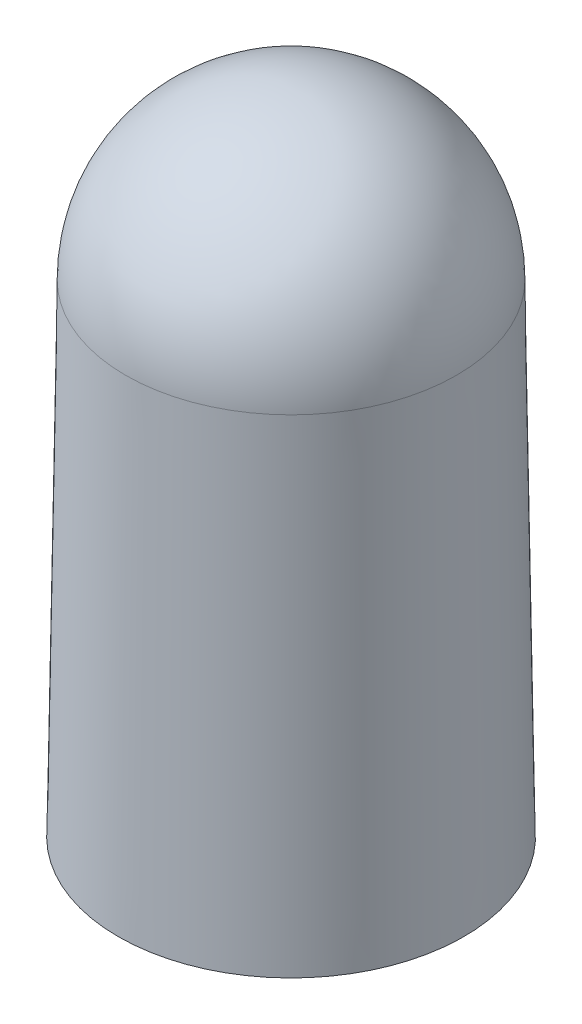
ISO-10303-21;
HEADER;
FILE_DESCRIPTION(('STEP AP214'),'2;1');
FILE_NAME('part.step','',(''),(''),'','','');
FILE_SCHEMA(('AUTOMOTIVE_DESIGN { 1 0 10303 214 1 1 1 1 }'));
ENDSEC;
DATA;
#1=APPLICATION_CONTEXT('core data for automotive mechanical design processes');
#2=APPLICATION_PROTOCOL_DEFINITION('international standard','automotive_design',2000,#1);
#3=PRODUCT_CONTEXT('',#1,'mechanical');
#4=PRODUCT('Part','Part','',(#3));
#5=PRODUCT_RELATED_PRODUCT_CATEGORY('part','',(#4));
#6=PRODUCT_DEFINITION_FORMATION('','',#4);
#7=PRODUCT_DEFINITION_CONTEXT('part definition',#1,'design');
#8=PRODUCT_DEFINITION('design','',#6,#7);
#9=PRODUCT_DEFINITION_SHAPE('','',#8);
#10=(LENGTH_UNIT() NAMED_UNIT(*) SI_UNIT(.MILLI.,.METRE.));
#11=(NAMED_UNIT(*) PLANE_ANGLE_UNIT() SI_UNIT($,.RADIAN.));
#12=(NAMED_UNIT(*) SI_UNIT($,.STERADIAN.) SOLID_ANGLE_UNIT());
#13=UNCERTAINTY_MEASURE_WITH_UNIT(LENGTH_MEASURE(1.E-05),#10,'distance_accuracy_value','');
#14=(GEOMETRIC_REPRESENTATION_CONTEXT(3) GLOBAL_UNCERTAINTY_ASSIGNED_CONTEXT((#13)) GLOBAL_UNIT_ASSIGNED_CONTEXT((#10,
#11,#12)) REPRESENTATION_CONTEXT('',''));
#15=CARTESIAN_POINT('',(0.,0.,0.));
#16=DIRECTION('',(0.,0.,1.));
#17=DIRECTION('',(1.,0.,0.));
#18=AXIS2_PLACEMENT_3D('',#15,#16,#17);
#19=CARTESIAN_POINT('',(0.,0.,0.));
#20=DIRECTION('',(0.,1.,0.));
#21=DIRECTION('',(1.,0.,0.));
#22=AXIS2_PLACEMENT_3D('',#19,#20,#21);
#23=SPHERICAL_SURFACE('',#22,12.);
#24=CARTESIAN_POINT('',(0.,0.,0.));
#25=DIRECTION('',(0.,1.,0.));
#26=DIRECTION('',(0.,0.,1.));
#27=AXIS2_PLACEMENT_3D('',#24,#25,#26);
#28=CIRCLE('',#27,12.);
#29=CARTESIAN_POINT('',(0.,0.,12.));
#30=VERTEX_POINT('',#29);
#31=EDGE_CURVE('E45',#30,#30,#28,.T.);
#32=ORIENTED_EDGE('',*,*,#31,.T.);
#33=EDGE_LOOP('',(#32));
#34=FACE_BOUND('',#33,.T.);
#35=ADVANCED_FACE('F31',(#34),#23,.T.);
#36=CARTESIAN_POINT('',(0.,0.,0.));
#37=DIRECTION('',(0.,1.,0.));
#38=DIRECTION('',(1.,0.,0.));
#39=AXIS2_PLACEMENT_3D('',#36,#37,#38);
#40=SPHERICAL_SURFACE('',#39,10.5);
#41=CARTESIAN_POINT('',(0.,0.,0.));
#42=DIRECTION('',(0.,1.,0.));
#43=DIRECTION('',(0.,0.,1.));
#44=AXIS2_PLACEMENT_3D('',#41,#42,#43);
#45=CIRCLE('',#44,10.5);
#46=CARTESIAN_POINT('',(0.,0.,10.5));
#47=VERTEX_POINT('',#46);
#48=EDGE_CURVE('E10',#47,#47,#45,.T.);
#49=ORIENTED_EDGE('',*,*,#48,.F.);
#50=EDGE_LOOP('',(#49));
#51=FACE_BOUND('',#50,.T.);
#52=ADVANCED_FACE('F65',(#51),#40,.F.);
#53=CARTESIAN_POINT('',(0.,12.,0.));
#54=DIRECTION('',(0.,1.,0.));
#55=DIRECTION('',(0.,0.,1.));
#56=AXIS2_PLACEMENT_3D('',#53,#54,#55);
#57=CYLINDRICAL_SURFACE('',#56,10.5);
#58=CARTESIAN_POINT('',(0.,-35.,0.));
#59=DIRECTION('',(0.,1.,0.));
#60=DIRECTION('',(0.,0.,1.));
#61=AXIS2_PLACEMENT_3D('',#58,#59,#60);
#62=CIRCLE('',#61,10.5);
#63=CARTESIAN_POINT('',(0.,-35.,10.5));
#64=VERTEX_POINT('',#63);
#65=EDGE_CURVE('E37',#64,#64,#62,.T.);
#66=ORIENTED_EDGE('',*,*,#65,.F.);
#67=EDGE_LOOP('',(#66));
#68=FACE_BOUND('',#67,.T.);
#69=ORIENTED_EDGE('',*,*,#48,.T.);
#70=EDGE_LOOP('',(#69));
#71=FACE_BOUND('',#70,.T.);
#72=ADVANCED_FACE('F60',(#68,#71),#57,.F.);
#73=CARTESIAN_POINT('',(10.5,-35.,0.));
#74=DIRECTION('',(0.,1.,0.));
#75=DIRECTION('',(0.,0.,1.));
#76=AXIS2_PLACEMENT_3D('',#73,#74,#75);
#77=PLANE('',#76);
#78=CARTESIAN_POINT('',(0.,-35.,0.));
#79=DIRECTION('',(0.,1.,0.));
#80=DIRECTION('',(0.,0.,1.));
#81=AXIS2_PLACEMENT_3D('',#78,#79,#80);
#82=CIRCLE('',#81,12.5374701380365);
#83=CARTESIAN_POINT('',(0.,-35.,12.5374701380365));
#84=VERTEX_POINT('',#83);
#85=EDGE_CURVE('E41',#84,#84,#82,.T.);
#86=ORIENTED_EDGE('',*,*,#85,.F.);
#87=EDGE_LOOP('',(#86));
#88=FACE_BOUND('',#87,.T.);
#89=ORIENTED_EDGE('',*,*,#65,.T.);
#90=EDGE_LOOP('',(#89));
#91=FACE_BOUND('',#90,.T.);
#92=ADVANCED_FACE('F55',(#88,#91),#77,.F.);
#93=CARTESIAN_POINT('',(0.,-35.,0.));
#94=DIRECTION('',(0.,-1.,0.));
#95=DIRECTION('',(0.,0.,-1.));
#96=AXIS2_PLACEMENT_3D('',#93,#94,#95);
#97=CONICAL_SURFACE('',#96,12.5374701380365,0.0153550827445634);
#98=ORIENTED_EDGE('',*,*,#31,.F.);
#99=EDGE_LOOP('',(#98));
#100=FACE_BOUND('',#99,.T.);
#101=ORIENTED_EDGE('',*,*,#85,.T.);
#102=EDGE_LOOP('',(#101));
#103=FACE_BOUND('',#102,.T.);
#104=ADVANCED_FACE('F52',(#100,#103),#97,.T.);
#105=CLOSED_SHELL('',(#35,#52,#72,#92,#104));
#106=MANIFOLD_SOLID_BREP('B2',#105);
#107=ADVANCED_BREP_SHAPE_REPRESENTATION('',(#18,#106),#14);
#108=SHAPE_DEFINITION_REPRESENTATION(#9,#107);
ENDSEC;
END-ISO-10303-21;
